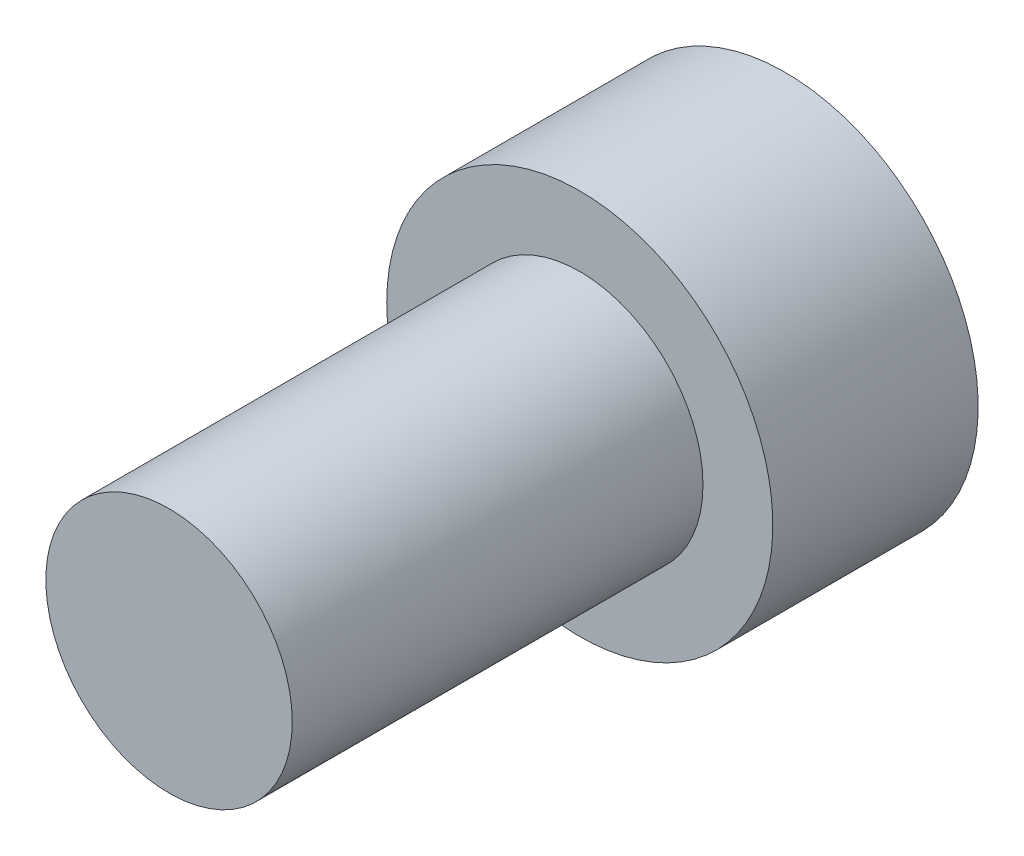
ISO-10303-21;
HEADER;
FILE_DESCRIPTION(('STEP AP214'),'2;1');
FILE_NAME('part.step','',(''),(''),'','','');
FILE_SCHEMA(('AUTOMOTIVE_DESIGN { 1 0 10303 214 1 1 1 1 }'));
ENDSEC;
DATA;
#1=APPLICATION_CONTEXT('core data for automotive mechanical design processes');
#2=APPLICATION_PROTOCOL_DEFINITION('international standard','automotive_design',2000,#1);
#3=PRODUCT_CONTEXT('',#1,'mechanical');
#4=PRODUCT('Part','Part','',(#3));
#5=PRODUCT_RELATED_PRODUCT_CATEGORY('part','',(#4));
#6=PRODUCT_DEFINITION_FORMATION('','',#4);
#7=PRODUCT_DEFINITION_CONTEXT('part definition',#1,'design');
#8=PRODUCT_DEFINITION('design','',#6,#7);
#9=PRODUCT_DEFINITION_SHAPE('','',#8);
#10=(LENGTH_UNIT() NAMED_UNIT(*) SI_UNIT(.MILLI.,.METRE.));
#11=(NAMED_UNIT(*) PLANE_ANGLE_UNIT() SI_UNIT($,.RADIAN.));
#12=(NAMED_UNIT(*) SI_UNIT($,.STERADIAN.) SOLID_ANGLE_UNIT());
#13=UNCERTAINTY_MEASURE_WITH_UNIT(LENGTH_MEASURE(1.E-05),#10,'distance_accuracy_value','');
#14=(GEOMETRIC_REPRESENTATION_CONTEXT(3) GLOBAL_UNCERTAINTY_ASSIGNED_CONTEXT((#13)) GLOBAL_UNIT_ASSIGNED_CONTEXT((#10,
#11,#12)) REPRESENTATION_CONTEXT('',''));
#15=CARTESIAN_POINT('',(0.,0.,0.));
#16=DIRECTION('',(0.,0.,1.));
#17=DIRECTION('',(1.,0.,0.));
#18=AXIS2_PLACEMENT_3D('',#15,#16,#17);
#19=CARTESIAN_POINT('',(0.,0.,5.));
#20=DIRECTION('',(0.,0.,-1.));
#21=DIRECTION('',(-1.,0.,0.));
#22=AXIS2_PLACEMENT_3D('',#19,#20,#21);
#23=CYLINDRICAL_SURFACE('',#22,1.5);
#24=CARTESIAN_POINT('',(0.,0.,5.));
#25=DIRECTION('',(0.,0.,1.));
#26=DIRECTION('',(1.,0.,0.));
#27=AXIS2_PLACEMENT_3D('',#24,#25,#26);
#28=CIRCLE('',#27,1.5);
#29=CARTESIAN_POINT('',(1.5,0.,5.));
#30=VERTEX_POINT('',#29);
#31=EDGE_CURVE('E10',#30,#30,#28,.T.);
#32=ORIENTED_EDGE('',*,*,#31,.F.);
#33=EDGE_LOOP('',(#32));
#34=FACE_BOUND('',#33,.T.);
#35=CARTESIAN_POINT('',(0.,0.,0.));
#36=DIRECTION('',(0.,0.,1.));
#37=DIRECTION('',(1.,0.,0.));
#38=AXIS2_PLACEMENT_3D('',#35,#36,#37);
#39=CIRCLE('',#38,1.5);
#40=CARTESIAN_POINT('',(1.5,0.,0.));
#41=VERTEX_POINT('',#40);
#42=EDGE_CURVE('E34',#41,#41,#39,.T.);
#43=ORIENTED_EDGE('',*,*,#42,.T.);
#44=EDGE_LOOP('',(#43));
#45=FACE_BOUND('',#44,.T.);
#46=ADVANCED_FACE('F31',(#34,#45),#23,.T.);
#47=CARTESIAN_POINT('',(0.,0.,5.));
#48=DIRECTION('',(0.,0.,1.));
#49=DIRECTION('',(1.,0.,0.));
#50=AXIS2_PLACEMENT_3D('',#47,#48,#49);
#51=PLANE('',#50);
#52=ORIENTED_EDGE('',*,*,#31,.T.);
#53=EDGE_LOOP('',(#52));
#54=FACE_BOUND('',#53,.T.);
#55=ADVANCED_FACE('F54',(#54),#51,.T.);
#56=CARTESIAN_POINT('',(0.,0.,-2.5));
#57=DIRECTION('',(0.,0.,1.));
#58=DIRECTION('',(1.,0.,0.));
#59=AXIS2_PLACEMENT_3D('',#56,#57,#58);
#60=CYLINDRICAL_SURFACE('',#59,2.35);
#61=CARTESIAN_POINT('',(0.,0.,-2.5));
#62=DIRECTION('',(0.,0.,-1.));
#63=DIRECTION('',(-1.,0.,0.));
#64=AXIS2_PLACEMENT_3D('',#61,#62,#63);
#65=CIRCLE('',#64,2.35);
#66=CARTESIAN_POINT('',(-2.35,0.,-2.5));
#67=VERTEX_POINT('',#66);
#68=EDGE_CURVE('E41',#67,#67,#65,.T.);
#69=ORIENTED_EDGE('',*,*,#68,.F.);
#70=EDGE_LOOP('',(#69));
#71=FACE_BOUND('',#70,.T.);
#72=CARTESIAN_POINT('',(0.,0.,0.));
#73=DIRECTION('',(0.,0.,-1.));
#74=DIRECTION('',(-1.,0.,0.));
#75=AXIS2_PLACEMENT_3D('',#72,#73,#74);
#76=CIRCLE('',#75,2.35);
#77=CARTESIAN_POINT('',(-2.35,0.,0.));
#78=VERTEX_POINT('',#77);
#79=EDGE_CURVE('E43',#78,#78,#76,.T.);
#80=ORIENTED_EDGE('',*,*,#79,.T.);
#81=EDGE_LOOP('',(#80));
#82=FACE_BOUND('',#81,.T.);
#83=ADVANCED_FACE('F51',(#71,#82),#60,.T.);
#84=CARTESIAN_POINT('',(0.,0.,-2.5));
#85=DIRECTION('',(0.,0.,-1.));
#86=DIRECTION('',(-1.,0.,0.));
#87=AXIS2_PLACEMENT_3D('',#84,#85,#86);
#88=PLANE('',#87);
#89=ORIENTED_EDGE('',*,*,#68,.T.);
#90=EDGE_LOOP('',(#89));
#91=FACE_BOUND('',#90,.T.);
#92=ADVANCED_FACE('F49',(#91),#88,.T.);
#93=CARTESIAN_POINT('',(0.,0.,0.));
#94=DIRECTION('',(0.,0.,-1.));
#95=DIRECTION('',(-1.,0.,0.));
#96=AXIS2_PLACEMENT_3D('',#93,#94,#95);
#97=PLANE('',#96);
#98=ORIENTED_EDGE('',*,*,#42,.F.);
#99=EDGE_LOOP('',(#98));
#100=FACE_BOUND('',#99,.T.);
#101=ORIENTED_EDGE('',*,*,#79,.F.);
#102=EDGE_LOOP('',(#101));
#103=FACE_BOUND('',#102,.T.);
#104=ADVANCED_FACE('F58',(#100,#103),#97,.F.);
#105=CLOSED_SHELL('',(#46,#55,#83,#92,#104));
#106=MANIFOLD_SOLID_BREP('B2',#105);
#107=ADVANCED_BREP_SHAPE_REPRESENTATION('',(#18,#106),#14);
#108=SHAPE_DEFINITION_REPRESENTATION(#9,#107);
ENDSEC;
END-ISO-10303-21;
